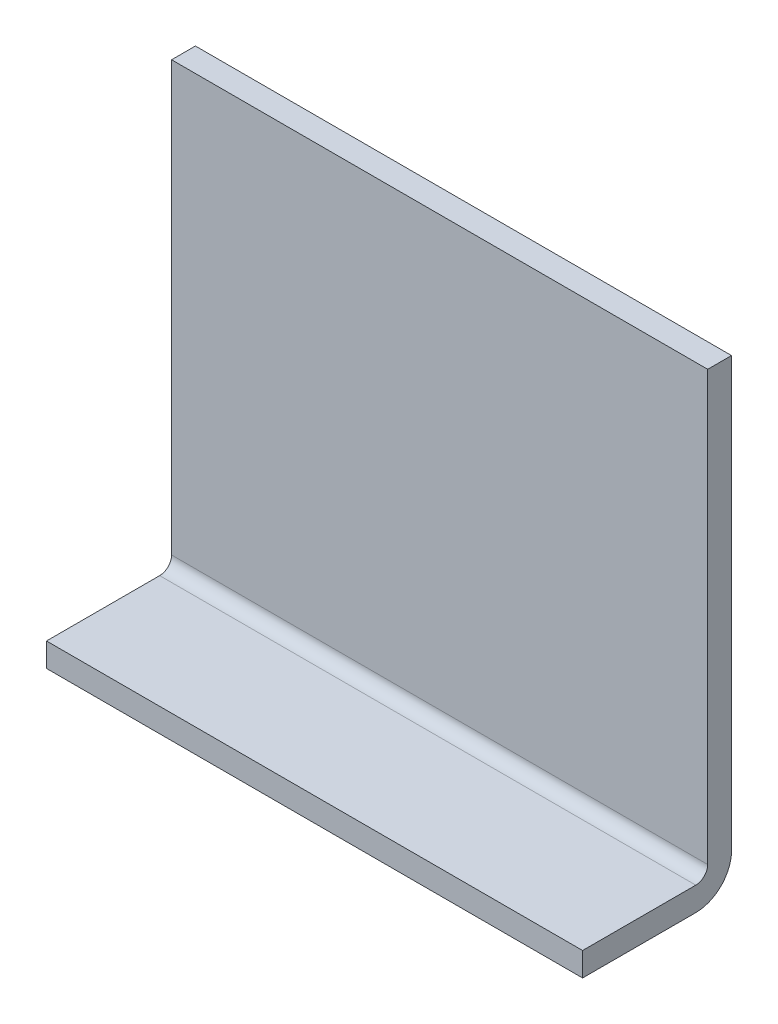
ISO-10303-21;
HEADER;
FILE_DESCRIPTION(('STEP AP214'),'2;1');
FILE_NAME('part.step','',(''),(''),'','','');
FILE_SCHEMA(('AUTOMOTIVE_DESIGN { 1 0 10303 214 1 1 1 1 }'));
ENDSEC;
DATA;
#1=APPLICATION_CONTEXT('core data for automotive mechanical design processes');
#2=APPLICATION_PROTOCOL_DEFINITION('international standard','automotive_design',2000,#1);
#3=PRODUCT_CONTEXT('',#1,'mechanical');
#4=PRODUCT('Part','Part','',(#3));
#5=PRODUCT_RELATED_PRODUCT_CATEGORY('part','',(#4));
#6=PRODUCT_DEFINITION_FORMATION('','',#4);
#7=PRODUCT_DEFINITION_CONTEXT('part definition',#1,'design');
#8=PRODUCT_DEFINITION('design','',#6,#7);
#9=PRODUCT_DEFINITION_SHAPE('','',#8);
#10=(LENGTH_UNIT() NAMED_UNIT(*) SI_UNIT(.MILLI.,.METRE.));
#11=(NAMED_UNIT(*) PLANE_ANGLE_UNIT() SI_UNIT($,.RADIAN.));
#12=(NAMED_UNIT(*) SI_UNIT($,.STERADIAN.) SOLID_ANGLE_UNIT());
#13=UNCERTAINTY_MEASURE_WITH_UNIT(LENGTH_MEASURE(1.E-05),#10,'distance_accuracy_value','');
#14=(GEOMETRIC_REPRESENTATION_CONTEXT(3) GLOBAL_UNCERTAINTY_ASSIGNED_CONTEXT((#13)) GLOBAL_UNIT_ASSIGNED_CONTEXT((#10,
#11,#12)) REPRESENTATION_CONTEXT('',''));
#15=CARTESIAN_POINT('',(0.,0.,0.));
#16=DIRECTION('',(0.,0.,1.));
#17=DIRECTION('',(1.,0.,0.));
#18=AXIS2_PLACEMENT_3D('',#15,#16,#17);
#19=CARTESIAN_POINT('',(0.,2.,0.));
#20=DIRECTION('',(1.,0.,0.));
#21=DIRECTION('',(0.,0.,-1.));
#22=AXIS2_PLACEMENT_3D('',#19,#20,#21);
#23=PLANE('',#22);
#24=DIRECTION('',(0.,-1.,0.));
#25=VECTOR('',#24,1.);
#26=CARTESIAN_POINT('',(0.,2.,-12.5));
#27=LINE('',#26,#25);
#28=CARTESIAN_POINT('',(0.,39.,-12.5));
#29=VERTEX_POINT('',#28);
#30=CARTESIAN_POINT('',(0.,3.,-12.5));
#31=VERTEX_POINT('',#30);
#32=EDGE_CURVE('E153',#29,#31,#27,.T.);
#33=ORIENTED_EDGE('',*,*,#32,.T.);
#34=CARTESIAN_POINT('',(0.,3.,-9.5));
#35=DIRECTION('',(1.,0.,0.));
#36=DIRECTION('',(0.,0.,-1.));
#37=AXIS2_PLACEMENT_3D('',#34,#35,#36);
#38=CIRCLE('',#37,3.);
#39=CARTESIAN_POINT('',(0.,0.,-9.5));
#40=VERTEX_POINT('',#39);
#41=EDGE_CURVE('E67',#31,#40,#38,.F.);
#42=ORIENTED_EDGE('',*,*,#41,.T.);
#43=DIRECTION('',(0.,0.,1.));
#44=VECTOR('',#43,1.);
#45=CARTESIAN_POINT('',(0.,0.,0.));
#46=LINE('',#45,#44);
#47=CARTESIAN_POINT('',(0.,0.,0.));
#48=VERTEX_POINT('',#47);
#49=EDGE_CURVE('E140',#40,#48,#46,.T.);
#50=ORIENTED_EDGE('',*,*,#49,.T.);
#51=DIRECTION('',(0.,-1.,0.));
#52=VECTOR('',#51,1.);
#53=CARTESIAN_POINT('',(0.,2.,0.));
#54=LINE('',#53,#52);
#55=CARTESIAN_POINT('',(0.,2.,0.));
#56=VERTEX_POINT('',#55);
#57=EDGE_CURVE('E171',#56,#48,#54,.T.);
#58=ORIENTED_EDGE('',*,*,#57,.F.);
#59=DIRECTION('',(0.,0.,1.));
#60=VECTOR('',#59,1.);
#61=CARTESIAN_POINT('',(0.,2.,0.));
#62=LINE('',#61,#60);
#63=CARTESIAN_POINT('',(0.,2.,-9.5));
#64=VERTEX_POINT('',#63);
#65=EDGE_CURVE('E142',#64,#56,#62,.T.);
#66=ORIENTED_EDGE('',*,*,#65,.F.);
#67=CARTESIAN_POINT('',(0.,3.,-9.5));
#68=DIRECTION('',(1.,0.,0.));
#69=DIRECTION('',(0.,0.,-1.));
#70=AXIS2_PLACEMENT_3D('',#67,#68,#69);
#71=CIRCLE('',#70,1.);
#72=CARTESIAN_POINT('',(0.,3.,-10.5));
#73=VERTEX_POINT('',#72);
#74=EDGE_CURVE('E113',#64,#73,#71,.T.);
#75=ORIENTED_EDGE('',*,*,#74,.T.);
#76=DIRECTION('',(0.,1.,0.));
#77=VECTOR('',#76,1.);
#78=CARTESIAN_POINT('',(0.,2.,-10.5));
#79=LINE('',#78,#77);
#80=CARTESIAN_POINT('',(0.,39.,-10.5));
#81=VERTEX_POINT('',#80);
#82=EDGE_CURVE('E108',#73,#81,#79,.T.);
#83=ORIENTED_EDGE('',*,*,#82,.T.);
#84=DIRECTION('',(0.,0.,-1.));
#85=VECTOR('',#84,1.);
#86=CARTESIAN_POINT('',(0.,39.,-10.5));
#87=LINE('',#86,#85);
#88=EDGE_CURVE('E110',#81,#29,#87,.T.);
#89=ORIENTED_EDGE('',*,*,#88,.T.);
#90=EDGE_LOOP('',(#33,#42,#50,#58,#66,#75,#83,#89));
#91=FACE_BOUND('',#90,.T.);
#92=ADVANCED_FACE('F44',(#91),#23,.F.);
#93=CARTESIAN_POINT('',(0.,2.,0.));
#94=DIRECTION('',(0.,0.,-1.));
#95=DIRECTION('',(-1.,0.,0.));
#96=AXIS2_PLACEMENT_3D('',#93,#94,#95);
#97=PLANE('',#96);
#98=DIRECTION('',(1.,0.,0.));
#99=VECTOR('',#98,1.);
#100=CARTESIAN_POINT('',(0.,0.,0.));
#101=LINE('',#100,#99);
#102=CARTESIAN_POINT('',(45.,0.,0.));
#103=VERTEX_POINT('',#102);
#104=EDGE_CURVE('E156',#48,#103,#101,.T.);
#105=ORIENTED_EDGE('',*,*,#104,.T.);
#106=DIRECTION('',(0.,-1.,0.));
#107=VECTOR('',#106,1.);
#108=CARTESIAN_POINT('',(45.,2.,0.));
#109=LINE('',#108,#107);
#110=CARTESIAN_POINT('',(45.,2.,0.));
#111=VERTEX_POINT('',#110);
#112=EDGE_CURVE('E167',#111,#103,#109,.T.);
#113=ORIENTED_EDGE('',*,*,#112,.F.);
#114=DIRECTION('',(1.,0.,0.));
#115=VECTOR('',#114,1.);
#116=CARTESIAN_POINT('',(0.,2.,0.));
#117=LINE('',#116,#115);
#118=EDGE_CURVE('E145',#56,#111,#117,.T.);
#119=ORIENTED_EDGE('',*,*,#118,.F.);
#120=ORIENTED_EDGE('',*,*,#57,.T.);
#121=EDGE_LOOP('',(#105,#113,#119,#120));
#122=FACE_BOUND('',#121,.T.);
#123=ADVANCED_FACE('F207',(#122),#97,.F.);
#124=CARTESIAN_POINT('',(45.,2.,0.));
#125=DIRECTION('',(-1.,0.,0.));
#126=DIRECTION('',(0.,0.,1.));
#127=AXIS2_PLACEMENT_3D('',#124,#125,#126);
#128=PLANE('',#127);
#129=DIRECTION('',(0.,0.,-1.));
#130=VECTOR('',#129,1.);
#131=CARTESIAN_POINT('',(45.,0.,0.));
#132=LINE('',#131,#130);
#133=CARTESIAN_POINT('',(45.,0.,-9.5));
#134=VERTEX_POINT('',#133);
#135=EDGE_CURVE('E146',#103,#134,#132,.T.);
#136=ORIENTED_EDGE('',*,*,#135,.T.);
#137=CARTESIAN_POINT('',(45.,3.,-9.5));
#138=DIRECTION('',(-1.,0.,0.));
#139=DIRECTION('',(0.,0.,1.));
#140=AXIS2_PLACEMENT_3D('',#137,#138,#139);
#141=CIRCLE('',#140,3.);
#142=CARTESIAN_POINT('',(45.,3.,-12.5));
#143=VERTEX_POINT('',#142);
#144=EDGE_CURVE('E11',#134,#143,#141,.F.);
#145=ORIENTED_EDGE('',*,*,#144,.T.);
#146=DIRECTION('',(0.,-1.,0.));
#147=VECTOR('',#146,1.);
#148=CARTESIAN_POINT('',(45.,2.,-12.5));
#149=LINE('',#148,#147);
#150=CARTESIAN_POINT('',(45.,39.,-12.5));
#151=VERTEX_POINT('',#150);
#152=EDGE_CURVE('E163',#151,#143,#149,.T.);
#153=ORIENTED_EDGE('',*,*,#152,.F.);
#154=DIRECTION('',(0.,0.,-1.));
#155=VECTOR('',#154,1.);
#156=CARTESIAN_POINT('',(45.,39.,-10.5));
#157=LINE('',#156,#155);
#158=CARTESIAN_POINT('',(45.,39.,-10.5));
#159=VERTEX_POINT('',#158);
#160=EDGE_CURVE('E128',#159,#151,#157,.T.);
#161=ORIENTED_EDGE('',*,*,#160,.F.);
#162=DIRECTION('',(0.,-1.,0.));
#163=VECTOR('',#162,1.);
#164=CARTESIAN_POINT('',(45.,2.,-10.5));
#165=LINE('',#164,#163);
#166=CARTESIAN_POINT('',(45.,3.,-10.5));
#167=VERTEX_POINT('',#166);
#168=EDGE_CURVE('E119',#159,#167,#165,.T.);
#169=ORIENTED_EDGE('',*,*,#168,.T.);
#170=CARTESIAN_POINT('',(45.,3.,-9.5));
#171=DIRECTION('',(-1.,0.,0.));
#172=DIRECTION('',(0.,0.,1.));
#173=AXIS2_PLACEMENT_3D('',#170,#171,#172);
#174=CIRCLE('',#173,1.);
#175=CARTESIAN_POINT('',(45.,2.,-9.5));
#176=VERTEX_POINT('',#175);
#177=EDGE_CURVE('E184',#167,#176,#174,.T.);
#178=ORIENTED_EDGE('',*,*,#177,.T.);
#179=DIRECTION('',(0.,0.,-1.));
#180=VECTOR('',#179,1.);
#181=CARTESIAN_POINT('',(45.,2.,0.));
#182=LINE('',#181,#180);
#183=EDGE_CURVE('E149',#111,#176,#182,.T.);
#184=ORIENTED_EDGE('',*,*,#183,.F.);
#185=ORIENTED_EDGE('',*,*,#112,.T.);
#186=EDGE_LOOP('',(#136,#145,#153,#161,#169,#178,#184,#185));
#187=FACE_BOUND('',#186,.T.);
#188=ADVANCED_FACE('F199',(#187),#128,.F.);
#189=CARTESIAN_POINT('',(0.,2.,-12.5));
#190=DIRECTION('',(0.,0.,1.));
#191=DIRECTION('',(1.,0.,0.));
#192=AXIS2_PLACEMENT_3D('',#189,#190,#191);
#193=PLANE('',#192);
#194=ORIENTED_EDGE('',*,*,#152,.T.);
#195=DIRECTION('',(-1.,0.,0.));
#196=VECTOR('',#195,1.);
#197=CARTESIAN_POINT('',(0.,3.,-12.5));
#198=LINE('',#197,#196);
#199=EDGE_CURVE('E187',#143,#31,#198,.T.);
#200=ORIENTED_EDGE('',*,*,#199,.T.);
#201=ORIENTED_EDGE('',*,*,#32,.F.);
#202=DIRECTION('',(1.,0.,0.));
#203=VECTOR('',#202,1.);
#204=CARTESIAN_POINT('',(45.,39.,-12.5));
#205=LINE('',#204,#203);
#206=EDGE_CURVE('E126',#29,#151,#205,.T.);
#207=ORIENTED_EDGE('',*,*,#206,.T.);
#208=EDGE_LOOP('',(#194,#200,#201,#207));
#209=FACE_BOUND('',#208,.T.);
#210=ADVANCED_FACE('F195',(#209),#193,.F.);
#211=CARTESIAN_POINT('',(0.,2.,0.));
#212=DIRECTION('',(0.,-1.,0.));
#213=DIRECTION('',(0.,0.,-1.));
#214=AXIS2_PLACEMENT_3D('',#211,#212,#213);
#215=PLANE('',#214);
#216=ORIENTED_EDGE('',*,*,#183,.T.);
#217=DIRECTION('',(-1.,0.,0.));
#218=VECTOR('',#217,1.);
#219=CARTESIAN_POINT('',(0.,2.,-9.5));
#220=LINE('',#219,#218);
#221=EDGE_CURVE('E175',#176,#64,#220,.T.);
#222=ORIENTED_EDGE('',*,*,#221,.T.);
#223=ORIENTED_EDGE('',*,*,#65,.T.);
#224=ORIENTED_EDGE('',*,*,#118,.T.);
#225=EDGE_LOOP('',(#216,#222,#223,#224));
#226=FACE_BOUND('',#225,.T.);
#227=ADVANCED_FACE('F209',(#226),#215,.F.);
#228=CARTESIAN_POINT('',(0.,0.,0.));
#229=DIRECTION('',(0.,-1.,0.));
#230=DIRECTION('',(0.,0.,-1.));
#231=AXIS2_PLACEMENT_3D('',#228,#229,#230);
#232=PLANE('',#231);
#233=ORIENTED_EDGE('',*,*,#49,.F.);
#234=DIRECTION('',(-1.,0.,0.));
#235=VECTOR('',#234,1.);
#236=CARTESIAN_POINT('',(45.,0.,-9.5));
#237=LINE('',#236,#235);
#238=EDGE_CURVE('E53',#40,#134,#237,.F.);
#239=ORIENTED_EDGE('',*,*,#238,.T.);
#240=ORIENTED_EDGE('',*,*,#135,.F.);
#241=ORIENTED_EDGE('',*,*,#104,.F.);
#242=EDGE_LOOP('',(#233,#239,#240,#241));
#243=FACE_BOUND('',#242,.T.);
#244=ADVANCED_FACE('F203',(#243),#232,.T.);
#245=CARTESIAN_POINT('',(45.,39.,-10.5));
#246=DIRECTION('',(0.,1.,0.));
#247=DIRECTION('',(0.,0.,1.));
#248=AXIS2_PLACEMENT_3D('',#245,#246,#247);
#249=PLANE('',#248);
#250=ORIENTED_EDGE('',*,*,#206,.F.);
#251=ORIENTED_EDGE('',*,*,#88,.F.);
#252=DIRECTION('',(1.,0.,0.));
#253=VECTOR('',#252,1.);
#254=CARTESIAN_POINT('',(45.,39.,-10.5));
#255=LINE('',#254,#253);
#256=EDGE_CURVE('E118',#81,#159,#255,.T.);
#257=ORIENTED_EDGE('',*,*,#256,.T.);
#258=ORIENTED_EDGE('',*,*,#160,.T.);
#259=EDGE_LOOP('',(#250,#251,#257,#258));
#260=FACE_BOUND('',#259,.T.);
#261=ADVANCED_FACE('F123',(#260),#249,.T.);
#262=CARTESIAN_POINT('',(0.,0.,-10.5));
#263=DIRECTION('',(0.,0.,1.));
#264=DIRECTION('',(1.,0.,0.));
#265=AXIS2_PLACEMENT_3D('',#262,#263,#264);
#266=PLANE('',#265);
#267=ORIENTED_EDGE('',*,*,#82,.F.);
#268=DIRECTION('',(-1.,0.,0.));
#269=VECTOR('',#268,1.);
#270=CARTESIAN_POINT('',(0.,3.,-10.5));
#271=LINE('',#270,#269);
#272=EDGE_CURVE('E179',#73,#167,#271,.F.);
#273=ORIENTED_EDGE('',*,*,#272,.T.);
#274=ORIENTED_EDGE('',*,*,#168,.F.);
#275=ORIENTED_EDGE('',*,*,#256,.F.);
#276=EDGE_LOOP('',(#267,#273,#274,#275));
#277=FACE_BOUND('',#276,.T.);
#278=ADVANCED_FACE('F131',(#277),#266,.T.);
#279=CARTESIAN_POINT('',(0.,3.,-9.5));
#280=DIRECTION('',(-1.,0.,0.));
#281=DIRECTION('',(0.,0.,1.));
#282=AXIS2_PLACEMENT_3D('',#279,#280,#281);
#283=CYLINDRICAL_SURFACE('',#282,1.);
#284=ORIENTED_EDGE('',*,*,#177,.F.);
#285=ORIENTED_EDGE('',*,*,#272,.F.);
#286=ORIENTED_EDGE('',*,*,#74,.F.);
#287=ORIENTED_EDGE('',*,*,#221,.F.);
#288=EDGE_LOOP('',(#284,#285,#286,#287));
#289=FACE_BOUND('',#288,.T.);
#290=ADVANCED_FACE('F213',(#289),#283,.F.);
#291=CARTESIAN_POINT('',(0.,3.,-9.5));
#292=DIRECTION('',(1.,0.,0.));
#293=DIRECTION('',(0.,0.,-1.));
#294=AXIS2_PLACEMENT_3D('',#291,#292,#293);
#295=CYLINDRICAL_SURFACE('',#294,3.);
#296=ORIENTED_EDGE('',*,*,#144,.F.);
#297=ORIENTED_EDGE('',*,*,#238,.F.);
#298=ORIENTED_EDGE('',*,*,#41,.F.);
#299=ORIENTED_EDGE('',*,*,#199,.F.);
#300=EDGE_LOOP('',(#296,#297,#298,#299));
#301=FACE_BOUND('',#300,.T.);
#302=ADVANCED_FACE('F46',(#301),#295,.T.);
#303=CLOSED_SHELL('',(#92,#123,#188,#210,#227,#244,#261,#278,#290,#302));
#304=MANIFOLD_SOLID_BREP('B2',#303);
#305=ADVANCED_BREP_SHAPE_REPRESENTATION('',(#18,#304),#14);
#306=SHAPE_DEFINITION_REPRESENTATION(#9,#305);
ENDSEC;
END-ISO-10303-21;
